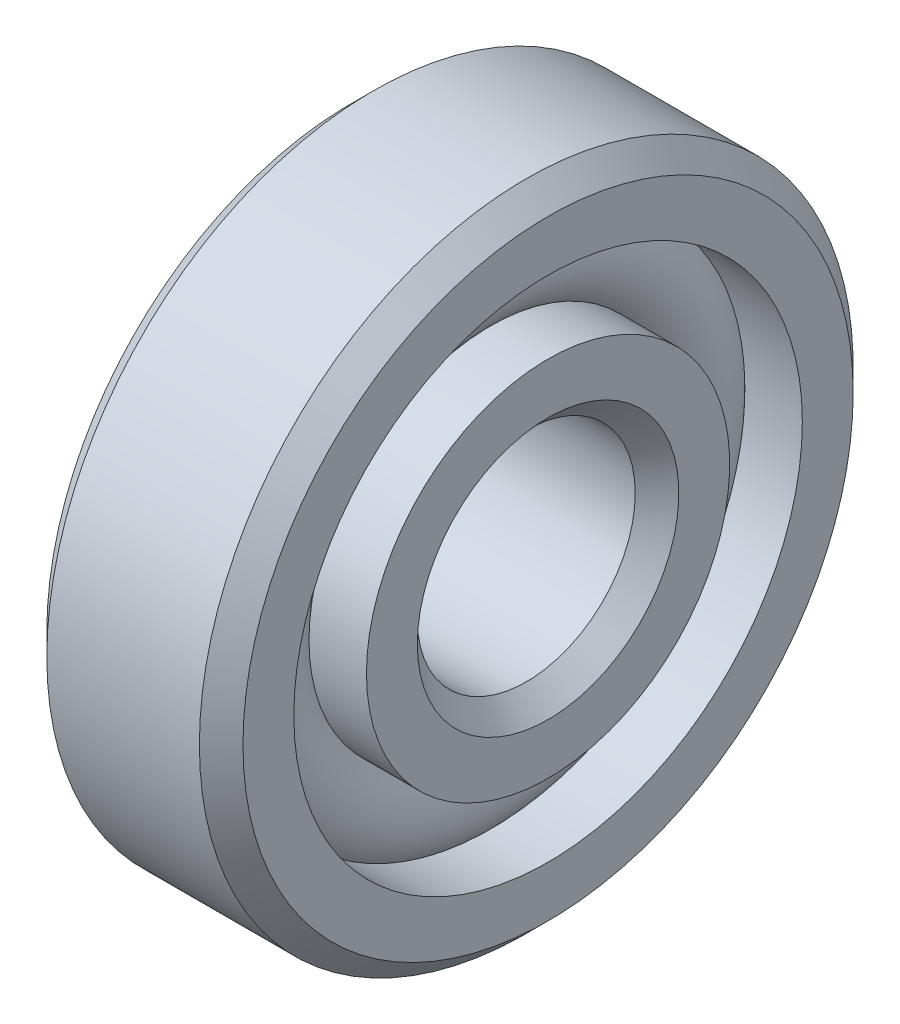
ISO-10303-21;
HEADER;
FILE_DESCRIPTION(('STEP AP214'),'2;1');
FILE_NAME('part.step','',(''),(''),'','','');
FILE_SCHEMA(('AUTOMOTIVE_DESIGN { 1 0 10303 214 1 1 1 1 }'));
ENDSEC;
DATA;
#1=APPLICATION_CONTEXT('core data for automotive mechanical design processes');
#2=APPLICATION_PROTOCOL_DEFINITION('international standard','automotive_design',2000,#1);
#3=PRODUCT_CONTEXT('',#1,'mechanical');
#4=PRODUCT('Part','Part','',(#3));
#5=PRODUCT_RELATED_PRODUCT_CATEGORY('part','',(#4));
#6=PRODUCT_DEFINITION_FORMATION('','',#4);
#7=PRODUCT_DEFINITION_CONTEXT('part definition',#1,'design');
#8=PRODUCT_DEFINITION('design','',#6,#7);
#9=PRODUCT_DEFINITION_SHAPE('','',#8);
#10=(LENGTH_UNIT() NAMED_UNIT(*) SI_UNIT(.MILLI.,.METRE.));
#11=(NAMED_UNIT(*) PLANE_ANGLE_UNIT() SI_UNIT($,.RADIAN.));
#12=(NAMED_UNIT(*) SI_UNIT($,.STERADIAN.) SOLID_ANGLE_UNIT());
#13=UNCERTAINTY_MEASURE_WITH_UNIT(LENGTH_MEASURE(1.E-05),#10,'distance_accuracy_value','');
#14=(GEOMETRIC_REPRESENTATION_CONTEXT(3) GLOBAL_UNCERTAINTY_ASSIGNED_CONTEXT((#13)) GLOBAL_UNIT_ASSIGNED_CONTEXT((#10,
#11,#12)) REPRESENTATION_CONTEXT('',''));
#15=CARTESIAN_POINT('',(0.,0.,0.));
#16=DIRECTION('',(0.,0.,1.));
#17=DIRECTION('',(1.,0.,0.));
#18=AXIS2_PLACEMENT_3D('',#15,#16,#17);
#19=CARTESIAN_POINT('',(4.5,0.,0.));
#20=DIRECTION('',(-1.,0.,0.));
#21=DIRECTION('',(0.,0.,1.));
#22=AXIS2_PLACEMENT_3D('',#19,#20,#21);
#23=TOROIDAL_SURFACE('',#22,10.,2.5);
#24=CARTESIAN_POINT('',(4.5,0.,12.5));
#25=VERTEX_POINT('',#24);
#26=VERTEX_LOOP('',#25);
#27=FACE_BOUND('',#26,.T.);
#28=ADVANCED_FACE('F110',(#27),#23,.T.);
#29=CLOSED_SHELL('',(#28));
#30=MANIFOLD_SOLID_BREP('B6',#29);
#31=CARTESIAN_POINT('',(4.5,0.,0.));
#32=DIRECTION('',(-1.,0.,0.));
#33=DIRECTION('',(0.,0.,1.));
#34=AXIS2_PLACEMENT_3D('',#31,#32,#33);
#35=TOROIDAL_SURFACE('',#34,10.,2.5);
#36=CARTESIAN_POINT('',(2.63661001875017,0.,0.));
#37=DIRECTION('',(-1.,0.,0.));
#38=DIRECTION('',(0.,0.,1.));
#39=AXIS2_PLACEMENT_3D('',#36,#37,#38);
#40=CIRCLE('',#39,11.6666666666667);
#41=CARTESIAN_POINT('',(2.63661001875017,0.,11.6666666666667));
#42=VERTEX_POINT('',#41);
#43=EDGE_CURVE('E158',#42,#42,#40,.T.);
#44=ORIENTED_EDGE('',*,*,#43,.T.);
#45=EDGE_LOOP('',(#44));
#46=FACE_BOUND('',#45,.T.);
#47=CARTESIAN_POINT('',(6.36338998124983,0.,0.));
#48=DIRECTION('',(-1.,0.,0.));
#49=DIRECTION('',(0.,0.,1.));
#50=AXIS2_PLACEMENT_3D('',#47,#48,#49);
#51=CIRCLE('',#50,11.6666666666667);
#52=CARTESIAN_POINT('',(6.36338998124983,0.,11.6666666666667));
#53=VERTEX_POINT('',#52);
#54=EDGE_CURVE('E149',#53,#53,#51,.T.);
#55=ORIENTED_EDGE('',*,*,#54,.F.);
#56=EDGE_LOOP('',(#55));
#57=FACE_BOUND('',#56,.T.);
#58=ADVANCED_FACE('F129',(#46,#57),#35,.F.);
#59=CARTESIAN_POINT('',(0.,0.,0.));
#60=DIRECTION('',(-1.,0.,0.));
#61=DIRECTION('',(0.,0.,1.));
#62=AXIS2_PLACEMENT_3D('',#59,#60,#61);
#63=CYLINDRICAL_SURFACE('',#62,11.6666666666667);
#64=CARTESIAN_POINT('',(9.,0.,0.));
#65=DIRECTION('',(-1.,0.,0.));
#66=DIRECTION('',(0.,0.,1.));
#67=AXIS2_PLACEMENT_3D('',#64,#65,#66);
#68=CIRCLE('',#67,11.6666666666667);
#69=CARTESIAN_POINT('',(9.,0.,11.6666666666667));
#70=VERTEX_POINT('',#69);
#71=EDGE_CURVE('E152',#70,#70,#68,.T.);
#72=ORIENTED_EDGE('',*,*,#71,.F.);
#73=EDGE_LOOP('',(#72));
#74=FACE_BOUND('',#73,.T.);
#75=ORIENTED_EDGE('',*,*,#54,.T.);
#76=EDGE_LOOP('',(#75));
#77=FACE_BOUND('',#76,.T.);
#78=ADVANCED_FACE('F182',(#74,#77),#63,.F.);
#79=CARTESIAN_POINT('',(9.,0.,0.));
#80=DIRECTION('',(-1.,0.,0.));
#81=DIRECTION('',(0.,0.,1.));
#82=AXIS2_PLACEMENT_3D('',#79,#80,#81);
#83=PLANE('',#82);
#84=CARTESIAN_POINT('',(9.,0.,0.));
#85=DIRECTION('',(-1.,0.,0.));
#86=DIRECTION('',(0.,0.,1.));
#87=AXIS2_PLACEMENT_3D('',#84,#85,#86);
#88=CIRCLE('',#87,14.);
#89=CARTESIAN_POINT('',(9.,0.,14.));
#90=VERTEX_POINT('',#89);
#91=EDGE_CURVE('E136',#90,#90,#88,.F.);
#92=ORIENTED_EDGE('',*,*,#91,.T.);
#93=EDGE_LOOP('',(#92));
#94=FACE_BOUND('',#93,.T.);
#95=ORIENTED_EDGE('',*,*,#71,.T.);
#96=EDGE_LOOP('',(#95));
#97=FACE_BOUND('',#96,.T.);
#98=ADVANCED_FACE('F178',(#94,#97),#83,.F.);
#99=CARTESIAN_POINT('',(0.,0.,0.));
#100=DIRECTION('',(-1.,0.,0.));
#101=DIRECTION('',(0.,0.,1.));
#102=AXIS2_PLACEMENT_3D('',#99,#100,#101);
#103=CYLINDRICAL_SURFACE('',#102,15.);
#104=CARTESIAN_POINT('',(7.99999999999999,0.,0.));
#105=DIRECTION('',(-1.,0.,0.));
#106=DIRECTION('',(0.,0.,1.));
#107=AXIS2_PLACEMENT_3D('',#104,#105,#106);
#108=CIRCLE('',#107,15.);
#109=CARTESIAN_POINT('',(7.99999999999999,0.,15.));
#110=VERTEX_POINT('',#109);
#111=EDGE_CURVE('E140',#110,#110,#108,.T.);
#112=ORIENTED_EDGE('',*,*,#111,.T.);
#113=EDGE_LOOP('',(#112));
#114=FACE_BOUND('',#113,.T.);
#115=CARTESIAN_POINT('',(1.,0.,0.));
#116=DIRECTION('',(-1.,0.,0.));
#117=DIRECTION('',(0.,0.,1.));
#118=AXIS2_PLACEMENT_3D('',#115,#116,#117);
#119=CIRCLE('',#118,15.);
#120=CARTESIAN_POINT('',(1.,0.,15.));
#121=VERTEX_POINT('',#120);
#122=EDGE_CURVE('E144',#121,#121,#119,.F.);
#123=ORIENTED_EDGE('',*,*,#122,.T.);
#124=EDGE_LOOP('',(#123));
#125=FACE_BOUND('',#124,.T.);
#126=ADVANCED_FACE('F173',(#114,#125),#103,.T.);
#127=CARTESIAN_POINT('',(0.,0.,0.));
#128=DIRECTION('',(-1.,0.,0.));
#129=DIRECTION('',(0.,0.,1.));
#130=AXIS2_PLACEMENT_3D('',#127,#128,#129);
#131=PLANE('',#130);
#132=CARTESIAN_POINT('',(0.,0.,0.));
#133=DIRECTION('',(-1.,0.,0.));
#134=DIRECTION('',(0.,0.,1.));
#135=AXIS2_PLACEMENT_3D('',#132,#133,#134);
#136=CIRCLE('',#135,14.);
#137=CARTESIAN_POINT('',(0.,0.,14.));
#138=VERTEX_POINT('',#137);
#139=EDGE_CURVE('E109',#138,#138,#136,.T.);
#140=ORIENTED_EDGE('',*,*,#139,.T.);
#141=EDGE_LOOP('',(#140));
#142=FACE_BOUND('',#141,.T.);
#143=CARTESIAN_POINT('',(0.,0.,0.));
#144=DIRECTION('',(-1.,0.,0.));
#145=DIRECTION('',(0.,0.,1.));
#146=AXIS2_PLACEMENT_3D('',#143,#144,#145);
#147=CIRCLE('',#146,11.6666666666667);
#148=CARTESIAN_POINT('',(0.,0.,11.6666666666667));
#149=VERTEX_POINT('',#148);
#150=EDGE_CURVE('E155',#149,#149,#147,.T.);
#151=ORIENTED_EDGE('',*,*,#150,.F.);
#152=EDGE_LOOP('',(#151));
#153=FACE_BOUND('',#152,.T.);
#154=ADVANCED_FACE('F168',(#142,#153),#131,.T.);
#155=CARTESIAN_POINT('',(0.,0.,0.));
#156=DIRECTION('',(-1.,0.,0.));
#157=DIRECTION('',(0.,0.,1.));
#158=AXIS2_PLACEMENT_3D('',#155,#156,#157);
#159=CYLINDRICAL_SURFACE('',#158,11.6666666666667);
#160=ORIENTED_EDGE('',*,*,#43,.F.);
#161=EDGE_LOOP('',(#160));
#162=FACE_BOUND('',#161,.T.);
#163=ORIENTED_EDGE('',*,*,#150,.T.);
#164=EDGE_LOOP('',(#163));
#165=FACE_BOUND('',#164,.T.);
#166=ADVANCED_FACE('F164',(#162,#165),#159,.F.);
#167=CARTESIAN_POINT('',(7.99999999999999,0.,0.));
#168=DIRECTION('',(-1.,0.,0.));
#169=DIRECTION('',(0.,0.,1.));
#170=AXIS2_PLACEMENT_3D('',#167,#168,#169);
#171=CONICAL_SURFACE('',#170,15.,0.785398163397449);
#172=ORIENTED_EDGE('',*,*,#91,.F.);
#173=EDGE_LOOP('',(#172));
#174=FACE_BOUND('',#173,.T.);
#175=ORIENTED_EDGE('',*,*,#111,.F.);
#176=EDGE_LOOP('',(#175));
#177=FACE_BOUND('',#176,.T.);
#178=ADVANCED_FACE('F167',(#174,#177),#171,.T.);
#179=CARTESIAN_POINT('',(0.,0.,0.));
#180=DIRECTION('',(1.,0.,0.));
#181=DIRECTION('',(0.,0.,-1.));
#182=AXIS2_PLACEMENT_3D('',#179,#180,#181);
#183=CONICAL_SURFACE('',#182,14.,0.785398163397448);
#184=ORIENTED_EDGE('',*,*,#122,.F.);
#185=EDGE_LOOP('',(#184));
#186=FACE_BOUND('',#185,.T.);
#187=ORIENTED_EDGE('',*,*,#139,.F.);
#188=EDGE_LOOP('',(#187));
#189=FACE_BOUND('',#188,.T.);
#190=ADVANCED_FACE('F131',(#186,#189),#183,.T.);
#191=CLOSED_SHELL('',(#58,#78,#98,#126,#154,#166,#178,#190));
#192=MANIFOLD_SOLID_BREP('B37',#191);
#193=CARTESIAN_POINT('',(4.5,0.,0.));
#194=DIRECTION('',(-1.,0.,0.));
#195=DIRECTION('',(0.,0.,1.));
#196=AXIS2_PLACEMENT_3D('',#193,#194,#195);
#197=TOROIDAL_SURFACE('',#196,10.,2.5);
#198=CARTESIAN_POINT('',(6.36338998124982,0.,0.));
#199=DIRECTION('',(-1.,0.,0.));
#200=DIRECTION('',(0.,0.,1.));
#201=AXIS2_PLACEMENT_3D('',#198,#199,#200);
#202=CIRCLE('',#201,8.33333333333333);
#203=CARTESIAN_POINT('',(6.36338998124982,0.,8.33333333333333));
#204=VERTEX_POINT('',#203);
#205=EDGE_CURVE('E279',#204,#204,#202,.T.);
#206=ORIENTED_EDGE('',*,*,#205,.T.);
#207=EDGE_LOOP('',(#206));
#208=FACE_BOUND('',#207,.T.);
#209=CARTESIAN_POINT('',(2.63661001875018,0.,0.));
#210=DIRECTION('',(-1.,0.,0.));
#211=DIRECTION('',(0.,0.,1.));
#212=AXIS2_PLACEMENT_3D('',#209,#210,#211);
#213=CIRCLE('',#212,8.33333333333333);
#214=CARTESIAN_POINT('',(2.63661001875018,0.,8.33333333333333));
#215=VERTEX_POINT('',#214);
#216=EDGE_CURVE('E270',#215,#215,#213,.T.);
#217=ORIENTED_EDGE('',*,*,#216,.F.);
#218=EDGE_LOOP('',(#217));
#219=FACE_BOUND('',#218,.T.);
#220=ADVANCED_FACE('F250',(#208,#219),#197,.F.);
#221=CARTESIAN_POINT('',(0.,0.,0.));
#222=DIRECTION('',(-1.,0.,0.));
#223=DIRECTION('',(0.,0.,1.));
#224=AXIS2_PLACEMENT_3D('',#221,#222,#223);
#225=CYLINDRICAL_SURFACE('',#224,8.33333333333333);
#226=ORIENTED_EDGE('',*,*,#216,.T.);
#227=EDGE_LOOP('',(#226));
#228=FACE_BOUND('',#227,.T.);
#229=CARTESIAN_POINT('',(0.,0.,0.));
#230=DIRECTION('',(-1.,0.,0.));
#231=DIRECTION('',(0.,0.,1.));
#232=AXIS2_PLACEMENT_3D('',#229,#230,#231);
#233=CIRCLE('',#232,8.33333333333333);
#234=CARTESIAN_POINT('',(0.,0.,8.33333333333333));
#235=VERTEX_POINT('',#234);
#236=EDGE_CURVE('E273',#235,#235,#233,.T.);
#237=ORIENTED_EDGE('',*,*,#236,.F.);
#238=EDGE_LOOP('',(#237));
#239=FACE_BOUND('',#238,.T.);
#240=ADVANCED_FACE('F300',(#228,#239),#225,.T.);
#241=CARTESIAN_POINT('',(0.,0.,0.));
#242=DIRECTION('',(-1.,0.,0.));
#243=DIRECTION('',(0.,0.,1.));
#244=AXIS2_PLACEMENT_3D('',#241,#242,#243);
#245=PLANE('',#244);
#246=CARTESIAN_POINT('',(0.,0.,0.));
#247=DIRECTION('',(-1.,0.,0.));
#248=DIRECTION('',(0.,0.,1.));
#249=AXIS2_PLACEMENT_3D('',#246,#247,#248);
#250=CIRCLE('',#249,6.);
#251=CARTESIAN_POINT('',(0.,0.,6.));
#252=VERTEX_POINT('',#251);
#253=EDGE_CURVE('E128',#252,#252,#250,.F.);
#254=ORIENTED_EDGE('',*,*,#253,.T.);
#255=EDGE_LOOP('',(#254));
#256=FACE_BOUND('',#255,.T.);
#257=ORIENTED_EDGE('',*,*,#236,.T.);
#258=EDGE_LOOP('',(#257));
#259=FACE_BOUND('',#258,.T.);
#260=ADVANCED_FACE('F305',(#256,#259),#245,.T.);
#261=CARTESIAN_POINT('',(0.,0.,0.));
#262=DIRECTION('',(-1.,0.,0.));
#263=DIRECTION('',(0.,0.,1.));
#264=AXIS2_PLACEMENT_3D('',#261,#262,#263);
#265=CYLINDRICAL_SURFACE('',#264,5.);
#266=CARTESIAN_POINT('',(8.,0.,0.));
#267=DIRECTION('',(-1.,0.,0.));
#268=DIRECTION('',(0.,0.,1.));
#269=AXIS2_PLACEMENT_3D('',#266,#267,#268);
#270=CIRCLE('',#269,5.);
#271=CARTESIAN_POINT('',(8.,0.,5.));
#272=VERTEX_POINT('',#271);
#273=EDGE_CURVE('E257',#272,#272,#270,.F.);
#274=ORIENTED_EDGE('',*,*,#273,.T.);
#275=EDGE_LOOP('',(#274));
#276=FACE_BOUND('',#275,.T.);
#277=CARTESIAN_POINT('',(1.,0.,0.));
#278=DIRECTION('',(-1.,0.,0.));
#279=DIRECTION('',(0.,0.,1.));
#280=AXIS2_PLACEMENT_3D('',#277,#278,#279);
#281=CIRCLE('',#280,5.);
#282=CARTESIAN_POINT('',(1.,0.,5.));
#283=VERTEX_POINT('',#282);
#284=EDGE_CURVE('E261',#283,#283,#281,.T.);
#285=ORIENTED_EDGE('',*,*,#284,.T.);
#286=EDGE_LOOP('',(#285));
#287=FACE_BOUND('',#286,.T.);
#288=ADVANCED_FACE('F296',(#276,#287),#265,.F.);
#289=CARTESIAN_POINT('',(9.,0.,0.));
#290=DIRECTION('',(-1.,0.,0.));
#291=DIRECTION('',(0.,0.,1.));
#292=AXIS2_PLACEMENT_3D('',#289,#290,#291);
#293=PLANE('',#292);
#294=CARTESIAN_POINT('',(9.,0.,0.));
#295=DIRECTION('',(-1.,0.,0.));
#296=DIRECTION('',(0.,0.,1.));
#297=AXIS2_PLACEMENT_3D('',#294,#295,#296);
#298=CIRCLE('',#297,6.);
#299=CARTESIAN_POINT('',(9.,0.,6.));
#300=VERTEX_POINT('',#299);
#301=EDGE_CURVE('E265',#300,#300,#298,.T.);
#302=ORIENTED_EDGE('',*,*,#301,.T.);
#303=EDGE_LOOP('',(#302));
#304=FACE_BOUND('',#303,.T.);
#305=CARTESIAN_POINT('',(9.,0.,0.));
#306=DIRECTION('',(-1.,0.,0.));
#307=DIRECTION('',(0.,0.,1.));
#308=AXIS2_PLACEMENT_3D('',#305,#306,#307);
#309=CIRCLE('',#308,8.33333333333333);
#310=CARTESIAN_POINT('',(9.,0.,8.33333333333333));
#311=VERTEX_POINT('',#310);
#312=EDGE_CURVE('E276',#311,#311,#309,.T.);
#313=ORIENTED_EDGE('',*,*,#312,.F.);
#314=EDGE_LOOP('',(#313));
#315=FACE_BOUND('',#314,.T.);
#316=ADVANCED_FACE('F288',(#304,#315),#293,.F.);
#317=CARTESIAN_POINT('',(0.,0.,0.));
#318=DIRECTION('',(-1.,0.,0.));
#319=DIRECTION('',(0.,0.,1.));
#320=AXIS2_PLACEMENT_3D('',#317,#318,#319);
#321=CYLINDRICAL_SURFACE('',#320,8.33333333333333);
#322=ORIENTED_EDGE('',*,*,#312,.T.);
#323=EDGE_LOOP('',(#322));
#324=FACE_BOUND('',#323,.T.);
#325=ORIENTED_EDGE('',*,*,#205,.F.);
#326=EDGE_LOOP('',(#325));
#327=FACE_BOUND('',#326,.T.);
#328=ADVANCED_FACE('F285',(#324,#327),#321,.T.);
#329=CARTESIAN_POINT('',(9.,0.,0.));
#330=DIRECTION('',(1.,0.,0.));
#331=DIRECTION('',(0.,0.,-1.));
#332=AXIS2_PLACEMENT_3D('',#329,#330,#331);
#333=CONICAL_SURFACE('',#332,6.,0.785398163397449);
#334=ORIENTED_EDGE('',*,*,#273,.F.);
#335=EDGE_LOOP('',(#334));
#336=FACE_BOUND('',#335,.T.);
#337=ORIENTED_EDGE('',*,*,#301,.F.);
#338=EDGE_LOOP('',(#337));
#339=FACE_BOUND('',#338,.T.);
#340=ADVANCED_FACE('F287',(#336,#339),#333,.F.);
#341=CARTESIAN_POINT('',(1.,0.,0.));
#342=DIRECTION('',(-1.,0.,0.));
#343=DIRECTION('',(0.,0.,1.));
#344=AXIS2_PLACEMENT_3D('',#341,#342,#343);
#345=CONICAL_SURFACE('',#344,5.,0.785398163397448);
#346=ORIENTED_EDGE('',*,*,#253,.F.);
#347=EDGE_LOOP('',(#346));
#348=FACE_BOUND('',#347,.T.);
#349=ORIENTED_EDGE('',*,*,#284,.F.);
#350=EDGE_LOOP('',(#349));
#351=FACE_BOUND('',#350,.T.);
#352=ADVANCED_FACE('F252',(#348,#351),#345,.F.);
#353=CLOSED_SHELL('',(#220,#240,#260,#288,#316,#328,#340,#352));
#354=MANIFOLD_SOLID_BREP('B104',#353);
#355=ADVANCED_BREP_SHAPE_REPRESENTATION('',(#18,#30,#192,#354),#14);
#356=SHAPE_DEFINITION_REPRESENTATION(#9,#355);
ENDSEC;
END-ISO-10303-21;
